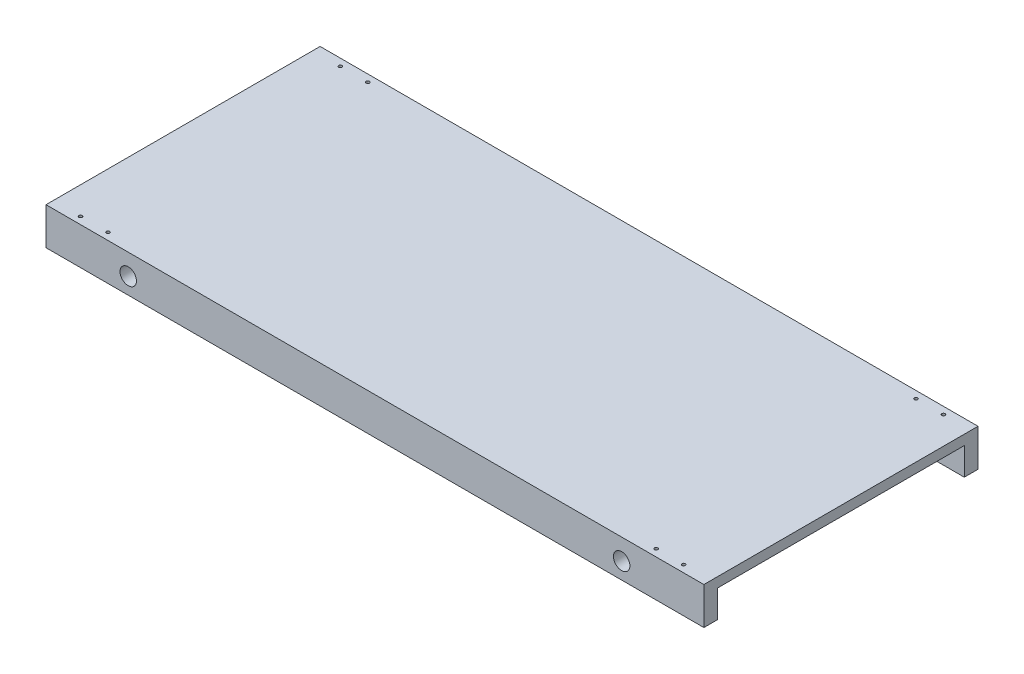
ISO-10303-21;
HEADER;
FILE_DESCRIPTION(('STEP AP214'),'2;1');
FILE_NAME('part.step','',(''),(''),'','','');
FILE_SCHEMA(('AUTOMOTIVE_DESIGN { 1 0 10303 214 1 1 1 1 }'));
ENDSEC;
DATA;
#1=APPLICATION_CONTEXT('core data for automotive mechanical design processes');
#2=APPLICATION_PROTOCOL_DEFINITION('international standard','automotive_design',2000,#1);
#3=PRODUCT_CONTEXT('',#1,'mechanical');
#4=PRODUCT('Part','Part','',(#3));
#5=PRODUCT_RELATED_PRODUCT_CATEGORY('part','',(#4));
#6=PRODUCT_DEFINITION_FORMATION('','',#4);
#7=PRODUCT_DEFINITION_CONTEXT('part definition',#1,'design');
#8=PRODUCT_DEFINITION('design','',#6,#7);
#9=PRODUCT_DEFINITION_SHAPE('','',#8);
#10=(LENGTH_UNIT() NAMED_UNIT(*) SI_UNIT(.MILLI.,.METRE.));
#11=(NAMED_UNIT(*) PLANE_ANGLE_UNIT() SI_UNIT($,.RADIAN.));
#12=(NAMED_UNIT(*) SI_UNIT($,.STERADIAN.) SOLID_ANGLE_UNIT());
#13=UNCERTAINTY_MEASURE_WITH_UNIT(LENGTH_MEASURE(1.E-05),#10,'distance_accuracy_value','');
#14=(GEOMETRIC_REPRESENTATION_CONTEXT(3) GLOBAL_UNCERTAINTY_ASSIGNED_CONTEXT((#13)) GLOBAL_UNIT_ASSIGNED_CONTEXT((#10,
#11,#12)) REPRESENTATION_CONTEXT('',''));
#15=CARTESIAN_POINT('',(0.,0.,0.));
#16=DIRECTION('',(0.,0.,1.));
#17=DIRECTION('',(1.,0.,0.));
#18=AXIS2_PLACEMENT_3D('',#15,#16,#17);
#19=CARTESIAN_POINT('',(0.,0.,0.));
#20=DIRECTION('',(0.,-1.,0.));
#21=DIRECTION('',(0.,0.,-1.));
#22=AXIS2_PLACEMENT_3D('',#19,#20,#21);
#23=PLANE('',#22);
#24=CARTESIAN_POINT('',(1100.,0.,-13.));
#25=DIRECTION('',(0.,1.,0.));
#26=DIRECTION('',(0.,0.,1.));
#27=AXIS2_PLACEMENT_3D('',#24,#25,#26);
#28=CIRCLE('',#27,2.99999999999989);
#29=CARTESIAN_POINT('',(1100.,0.,-10.0000000000001));
#30=VERTEX_POINT('',#29);
#31=EDGE_CURVE('E260',#30,#30,#28,.T.);
#32=ORIENTED_EDGE('',*,*,#31,.T.);
#33=EDGE_LOOP('',(#32));
#34=FACE_BOUND('',#33,.T.);
#35=CARTESIAN_POINT('',(1150.,0.,-13.));
#36=DIRECTION('',(0.,1.,0.));
#37=DIRECTION('',(0.,0.,1.));
#38=AXIS2_PLACEMENT_3D('',#35,#36,#37);
#39=CIRCLE('',#38,2.99999999999989);
#40=CARTESIAN_POINT('',(1150.,0.,-10.0000000000001));
#41=VERTEX_POINT('',#40);
#42=EDGE_CURVE('E252',#41,#41,#39,.T.);
#43=ORIENTED_EDGE('',*,*,#42,.T.);
#44=EDGE_LOOP('',(#43));
#45=FACE_BOUND('',#44,.T.);
#46=CARTESIAN_POINT('',(50.,0.,-13.));
#47=DIRECTION('',(0.,1.,0.));
#48=DIRECTION('',(0.,0.,1.));
#49=AXIS2_PLACEMENT_3D('',#46,#47,#48);
#50=CIRCLE('',#49,2.99999999999999);
#51=CARTESIAN_POINT('',(50.,0.,-10.));
#52=VERTEX_POINT('',#51);
#53=EDGE_CURVE('E244',#52,#52,#50,.T.);
#54=ORIENTED_EDGE('',*,*,#53,.T.);
#55=EDGE_LOOP('',(#54));
#56=FACE_BOUND('',#55,.T.);
#57=CARTESIAN_POINT('',(100.,0.,-13.));
#58=DIRECTION('',(0.,1.,0.));
#59=DIRECTION('',(0.,0.,1.));
#60=AXIS2_PLACEMENT_3D('',#57,#58,#59);
#61=CIRCLE('',#60,2.99999999999999);
#62=CARTESIAN_POINT('',(100.,0.,-10.));
#63=VERTEX_POINT('',#62);
#64=EDGE_CURVE('E236',#63,#63,#61,.T.);
#65=ORIENTED_EDGE('',*,*,#64,.T.);
#66=EDGE_LOOP('',(#65));
#67=FACE_BOUND('',#66,.T.);
#68=DIRECTION('',(-1.,0.,0.));
#69=VECTOR('',#68,1.);
#70=CARTESIAN_POINT('',(0.,0.,-25.));
#71=LINE('',#70,#69);
#72=CARTESIAN_POINT('',(1200.,0.,-25.));
#73=VERTEX_POINT('',#72);
#74=CARTESIAN_POINT('',(0.,0.,-25.));
#75=VERTEX_POINT('',#74);
#76=EDGE_CURVE('E133',#73,#75,#71,.T.);
#77=ORIENTED_EDGE('',*,*,#76,.F.);
#78=DIRECTION('',(0.,0.,-1.));
#79=VECTOR('',#78,1.);
#80=CARTESIAN_POINT('',(1200.,0.,0.));
#81=LINE('',#80,#79);
#82=CARTESIAN_POINT('',(1200.,0.,0.));
#83=VERTEX_POINT('',#82);
#84=EDGE_CURVE('E190',#83,#73,#81,.T.);
#85=ORIENTED_EDGE('',*,*,#84,.F.);
#86=DIRECTION('',(1.,0.,0.));
#87=VECTOR('',#86,1.);
#88=CARTESIAN_POINT('',(0.,0.,0.));
#89=LINE('',#88,#87);
#90=CARTESIAN_POINT('',(0.,0.,0.));
#91=VERTEX_POINT('',#90);
#92=EDGE_CURVE('E186',#91,#83,#89,.T.);
#93=ORIENTED_EDGE('',*,*,#92,.F.);
#94=DIRECTION('',(0.,0.,1.));
#95=VECTOR('',#94,1.);
#96=CARTESIAN_POINT('',(0.,0.,0.));
#97=LINE('',#96,#95);
#98=EDGE_CURVE('E169',#75,#91,#97,.T.);
#99=ORIENTED_EDGE('',*,*,#98,.F.);
#100=EDGE_LOOP('',(#77,#85,#93,#99));
#101=FACE_BOUND('',#100,.T.);
#102=ADVANCED_FACE('F38',(#34,#45,#56,#67,#101),#23,.T.);
#103=CARTESIAN_POINT('',(150.,30.,-500.));
#104=DIRECTION('',(0.,0.,1.));
#105=DIRECTION('',(1.,0.,0.));
#106=AXIS2_PLACEMENT_3D('',#103,#104,#105);
#107=CYLINDRICAL_SURFACE('',#106,15.);
#108=CARTESIAN_POINT('',(150.,30.,-25.));
#109=DIRECTION('',(0.,0.,1.));
#110=DIRECTION('',(1.,0.,0.));
#111=AXIS2_PLACEMENT_3D('',#108,#109,#110);
#112=CIRCLE('',#111,15.);
#113=CARTESIAN_POINT('',(165.,30.,-25.));
#114=VERTEX_POINT('',#113);
#115=EDGE_CURVE('E152',#114,#114,#112,.F.);
#116=ORIENTED_EDGE('',*,*,#115,.T.);
#117=EDGE_LOOP('',(#116));
#118=FACE_BOUND('',#117,.T.);
#119=CARTESIAN_POINT('',(150.,30.,0.));
#120=DIRECTION('',(0.,0.,1.));
#121=DIRECTION('',(1.,0.,0.));
#122=AXIS2_PLACEMENT_3D('',#119,#120,#121);
#123=CIRCLE('',#122,15.);
#124=CARTESIAN_POINT('',(165.,30.,0.));
#125=VERTEX_POINT('',#124);
#126=EDGE_CURVE('E161',#125,#125,#123,.T.);
#127=ORIENTED_EDGE('',*,*,#126,.T.);
#128=EDGE_LOOP('',(#127));
#129=FACE_BOUND('',#128,.T.);
#130=ADVANCED_FACE('F345',(#118,#129),#107,.F.);
#131=CARTESIAN_POINT('',(1050.,30.,0.));
#132=DIRECTION('',(0.,0.,-1.));
#133=DIRECTION('',(-1.,0.,0.));
#134=AXIS2_PLACEMENT_3D('',#131,#132,#133);
#135=CYLINDRICAL_SURFACE('',#134,14.9999999999999);
#136=CARTESIAN_POINT('',(1050.,30.,-25.));
#137=DIRECTION('',(0.,0.,1.));
#138=DIRECTION('',(1.,0.,0.));
#139=AXIS2_PLACEMENT_3D('',#136,#137,#138);
#140=CIRCLE('',#139,14.9999999999999);
#141=CARTESIAN_POINT('',(1065.,30.,-25.));
#142=VERTEX_POINT('',#141);
#143=EDGE_CURVE('E42',#142,#142,#140,.F.);
#144=ORIENTED_EDGE('',*,*,#143,.T.);
#145=EDGE_LOOP('',(#144));
#146=FACE_BOUND('',#145,.T.);
#147=CARTESIAN_POINT('',(1050.,30.,0.));
#148=DIRECTION('',(0.,0.,-1.));
#149=DIRECTION('',(-1.,0.,0.));
#150=AXIS2_PLACEMENT_3D('',#147,#148,#149);
#151=CIRCLE('',#150,14.9999999999999);
#152=CARTESIAN_POINT('',(1035.,30.,0.));
#153=VERTEX_POINT('',#152);
#154=EDGE_CURVE('E157',#153,#153,#151,.T.);
#155=ORIENTED_EDGE('',*,*,#154,.F.);
#156=EDGE_LOOP('',(#155));
#157=FACE_BOUND('',#156,.T.);
#158=ADVANCED_FACE('F329',(#146,#157),#135,.F.);
#159=CARTESIAN_POINT('',(0.,68.,0.));
#160=DIRECTION('',(1.,0.,0.));
#161=DIRECTION('',(0.,0.,-1.));
#162=AXIS2_PLACEMENT_3D('',#159,#160,#161);
#163=PLANE('',#162);
#164=DIRECTION('',(0.,0.,-1.));
#165=VECTOR('',#164,1.);
#166=CARTESIAN_POINT('',(0.,50.,-25.));
#167=LINE('',#166,#165);
#168=CARTESIAN_POINT('',(0.,50.,-25.));
#169=VERTEX_POINT('',#168);
#170=CARTESIAN_POINT('',(0.,50.,-475.));
#171=VERTEX_POINT('',#170);
#172=EDGE_CURVE('E123',#169,#171,#167,.T.);
#173=ORIENTED_EDGE('',*,*,#172,.F.);
#174=DIRECTION('',(0.,-1.,0.));
#175=VECTOR('',#174,1.);
#176=CARTESIAN_POINT('',(0.,50.,-25.));
#177=LINE('',#176,#175);
#178=EDGE_CURVE('E205',#169,#75,#177,.T.);
#179=ORIENTED_EDGE('',*,*,#178,.T.);
#180=ORIENTED_EDGE('',*,*,#98,.T.);
#181=DIRECTION('',(0.,-1.,0.));
#182=VECTOR('',#181,1.);
#183=CARTESIAN_POINT('',(0.,68.,0.));
#184=LINE('',#183,#182);
#185=CARTESIAN_POINT('',(0.,68.,0.));
#186=VERTEX_POINT('',#185);
#187=EDGE_CURVE('E11',#186,#91,#184,.T.);
#188=ORIENTED_EDGE('',*,*,#187,.F.);
#189=DIRECTION('',(0.,0.,1.));
#190=VECTOR('',#189,1.);
#191=CARTESIAN_POINT('',(0.,68.,0.));
#192=LINE('',#191,#190);
#193=CARTESIAN_POINT('',(0.,68.,-500.));
#194=VERTEX_POINT('',#193);
#195=EDGE_CURVE('E173',#194,#186,#192,.T.);
#196=ORIENTED_EDGE('',*,*,#195,.F.);
#197=DIRECTION('',(0.,-1.,0.));
#198=VECTOR('',#197,1.);
#199=CARTESIAN_POINT('',(0.,68.,-500.));
#200=LINE('',#199,#198);
#201=CARTESIAN_POINT('',(0.,0.,-500.));
#202=VERTEX_POINT('',#201);
#203=EDGE_CURVE('E183',#194,#202,#200,.T.);
#204=ORIENTED_EDGE('',*,*,#203,.T.);
#205=CARTESIAN_POINT('',(0.,0.,-475.));
#206=VERTEX_POINT('',#205);
#207=EDGE_CURVE('E137',#202,#206,#97,.T.);
#208=ORIENTED_EDGE('',*,*,#207,.T.);
#209=DIRECTION('',(0.,-1.,0.));
#210=VECTOR('',#209,1.);
#211=CARTESIAN_POINT('',(0.,50.,-475.));
#212=LINE('',#211,#210);
#213=EDGE_CURVE('E56',#171,#206,#212,.T.);
#214=ORIENTED_EDGE('',*,*,#213,.F.);
#215=EDGE_LOOP('',(#173,#179,#180,#188,#196,#204,#208,#214));
#216=FACE_BOUND('',#215,.T.);
#217=ADVANCED_FACE('F40',(#216),#163,.F.);
#218=CARTESIAN_POINT('',(0.,68.,0.));
#219=DIRECTION('',(0.,0.,-1.));
#220=DIRECTION('',(-1.,0.,0.));
#221=AXIS2_PLACEMENT_3D('',#218,#219,#220);
#222=PLANE('',#221);
#223=ORIENTED_EDGE('',*,*,#154,.T.);
#224=EDGE_LOOP('',(#223));
#225=FACE_BOUND('',#224,.T.);
#226=ORIENTED_EDGE('',*,*,#126,.F.);
#227=EDGE_LOOP('',(#226));
#228=FACE_BOUND('',#227,.T.);
#229=ORIENTED_EDGE('',*,*,#92,.T.);
#230=DIRECTION('',(0.,-1.,0.));
#231=VECTOR('',#230,1.);
#232=CARTESIAN_POINT('',(1200.,68.,0.));
#233=LINE('',#232,#231);
#234=CARTESIAN_POINT('',(1200.,68.,0.));
#235=VERTEX_POINT('',#234);
#236=EDGE_CURVE('E48',#235,#83,#233,.T.);
#237=ORIENTED_EDGE('',*,*,#236,.F.);
#238=DIRECTION('',(1.,0.,0.));
#239=VECTOR('',#238,1.);
#240=CARTESIAN_POINT('',(0.,68.,0.));
#241=LINE('',#240,#239);
#242=EDGE_CURVE('E93',#186,#235,#241,.T.);
#243=ORIENTED_EDGE('',*,*,#242,.F.);
#244=ORIENTED_EDGE('',*,*,#187,.T.);
#245=EDGE_LOOP('',(#229,#237,#243,#244));
#246=FACE_BOUND('',#245,.T.);
#247=ADVANCED_FACE('F309',(#225,#228,#246),#222,.F.);
#248=CARTESIAN_POINT('',(1200.,68.,0.));
#249=DIRECTION('',(-1.,0.,0.));
#250=DIRECTION('',(0.,0.,1.));
#251=AXIS2_PLACEMENT_3D('',#248,#249,#250);
#252=PLANE('',#251);
#253=ORIENTED_EDGE('',*,*,#84,.T.);
#254=DIRECTION('',(0.,-1.,0.));
#255=VECTOR('',#254,1.);
#256=CARTESIAN_POINT('',(1200.,50.,-25.));
#257=LINE('',#256,#255);
#258=CARTESIAN_POINT('',(1200.,50.,-25.));
#259=VERTEX_POINT('',#258);
#260=EDGE_CURVE('E142',#259,#73,#257,.T.);
#261=ORIENTED_EDGE('',*,*,#260,.F.);
#262=DIRECTION('',(0.,0.,1.));
#263=VECTOR('',#262,1.);
#264=CARTESIAN_POINT('',(1200.,50.,-25.));
#265=LINE('',#264,#263);
#266=CARTESIAN_POINT('',(1200.,50.,-475.));
#267=VERTEX_POINT('',#266);
#268=EDGE_CURVE('E122',#267,#259,#265,.T.);
#269=ORIENTED_EDGE('',*,*,#268,.F.);
#270=DIRECTION('',(0.,-1.,0.));
#271=VECTOR('',#270,1.);
#272=CARTESIAN_POINT('',(1200.,50.,-475.));
#273=LINE('',#272,#271);
#274=CARTESIAN_POINT('',(1200.,0.,-475.));
#275=VERTEX_POINT('',#274);
#276=EDGE_CURVE('E118',#267,#275,#273,.T.);
#277=ORIENTED_EDGE('',*,*,#276,.T.);
#278=CARTESIAN_POINT('',(1200.,0.,-500.));
#279=VERTEX_POINT('',#278);
#280=EDGE_CURVE('E189',#275,#279,#81,.T.);
#281=ORIENTED_EDGE('',*,*,#280,.T.);
#282=DIRECTION('',(0.,-1.,0.));
#283=VECTOR('',#282,1.);
#284=CARTESIAN_POINT('',(1200.,68.,-500.));
#285=LINE('',#284,#283);
#286=CARTESIAN_POINT('',(1200.,68.,-500.));
#287=VERTEX_POINT('',#286);
#288=EDGE_CURVE('E198',#287,#279,#285,.T.);
#289=ORIENTED_EDGE('',*,*,#288,.F.);
#290=DIRECTION('',(0.,0.,-1.));
#291=VECTOR('',#290,1.);
#292=CARTESIAN_POINT('',(1200.,68.,0.));
#293=LINE('',#292,#291);
#294=EDGE_CURVE('E178',#235,#287,#293,.T.);
#295=ORIENTED_EDGE('',*,*,#294,.F.);
#296=ORIENTED_EDGE('',*,*,#236,.T.);
#297=EDGE_LOOP('',(#253,#261,#269,#277,#281,#289,#295,#296));
#298=FACE_BOUND('',#297,.T.);
#299=ADVANCED_FACE('F314',(#298),#252,.F.);
#300=CARTESIAN_POINT('',(0.,68.,-500.));
#301=DIRECTION('',(0.,0.,1.));
#302=DIRECTION('',(1.,0.,0.));
#303=AXIS2_PLACEMENT_3D('',#300,#301,#302);
#304=PLANE('',#303);
#305=CARTESIAN_POINT('',(1050.,30.,-500.));
#306=DIRECTION('',(0.,0.,-1.));
#307=DIRECTION('',(-1.,0.,0.));
#308=AXIS2_PLACEMENT_3D('',#305,#306,#307);
#309=CIRCLE('',#308,14.9999999999999);
#310=CARTESIAN_POINT('',(1035.,30.,-500.));
#311=VERTEX_POINT('',#310);
#312=EDGE_CURVE('E156',#311,#311,#309,.T.);
#313=ORIENTED_EDGE('',*,*,#312,.F.);
#314=EDGE_LOOP('',(#313));
#315=FACE_BOUND('',#314,.T.);
#316=CARTESIAN_POINT('',(150.,30.,-500.));
#317=DIRECTION('',(0.,0.,1.));
#318=DIRECTION('',(1.,0.,0.));
#319=AXIS2_PLACEMENT_3D('',#316,#317,#318);
#320=CIRCLE('',#319,15.);
#321=CARTESIAN_POINT('',(165.,30.,-500.));
#322=VERTEX_POINT('',#321);
#323=EDGE_CURVE('E165',#322,#322,#320,.T.);
#324=ORIENTED_EDGE('',*,*,#323,.T.);
#325=EDGE_LOOP('',(#324));
#326=FACE_BOUND('',#325,.T.);
#327=DIRECTION('',(-1.,0.,0.));
#328=VECTOR('',#327,1.);
#329=CARTESIAN_POINT('',(0.,0.,-500.));
#330=LINE('',#329,#328);
#331=EDGE_CURVE('E86',#279,#202,#330,.T.);
#332=ORIENTED_EDGE('',*,*,#331,.T.);
#333=ORIENTED_EDGE('',*,*,#203,.F.);
#334=DIRECTION('',(-1.,0.,0.));
#335=VECTOR('',#334,1.);
#336=CARTESIAN_POINT('',(0.,68.,-500.));
#337=LINE('',#336,#335);
#338=EDGE_CURVE('E65',#287,#194,#337,.T.);
#339=ORIENTED_EDGE('',*,*,#338,.F.);
#340=ORIENTED_EDGE('',*,*,#288,.T.);
#341=EDGE_LOOP('',(#332,#333,#339,#340));
#342=FACE_BOUND('',#341,.T.);
#343=ADVANCED_FACE('F291',(#315,#326,#342),#304,.F.);
#344=CARTESIAN_POINT('',(0.,68.,0.));
#345=DIRECTION('',(0.,-1.,0.));
#346=DIRECTION('',(0.,0.,-1.));
#347=AXIS2_PLACEMENT_3D('',#344,#345,#346);
#348=PLANE('',#347);
#349=CARTESIAN_POINT('',(1150.,68.,-487.));
#350=DIRECTION('',(0.,1.,0.));
#351=DIRECTION('',(0.,0.,1.));
#352=AXIS2_PLACEMENT_3D('',#349,#350,#351);
#353=CIRCLE('',#352,2.99999999999989);
#354=CARTESIAN_POINT('',(1150.,68.,-484.));
#355=VERTEX_POINT('',#354);
#356=EDGE_CURVE('E280',#355,#355,#353,.T.);
#357=ORIENTED_EDGE('',*,*,#356,.F.);
#358=EDGE_LOOP('',(#357));
#359=FACE_BOUND('',#358,.T.);
#360=CARTESIAN_POINT('',(1100.,68.,-487.));
#361=DIRECTION('',(0.,1.,0.));
#362=DIRECTION('',(0.,0.,1.));
#363=AXIS2_PLACEMENT_3D('',#360,#361,#362);
#364=CIRCLE('',#363,2.99999999999989);
#365=CARTESIAN_POINT('',(1100.,68.,-484.));
#366=VERTEX_POINT('',#365);
#367=EDGE_CURVE('E272',#366,#366,#364,.T.);
#368=ORIENTED_EDGE('',*,*,#367,.F.);
#369=EDGE_LOOP('',(#368));
#370=FACE_BOUND('',#369,.T.);
#371=CARTESIAN_POINT('',(1100.,68.,-13.));
#372=DIRECTION('',(0.,1.,0.));
#373=DIRECTION('',(0.,0.,1.));
#374=AXIS2_PLACEMENT_3D('',#371,#372,#373);
#375=CIRCLE('',#374,2.99999999999989);
#376=CARTESIAN_POINT('',(1100.,68.,-10.0000000000001));
#377=VERTEX_POINT('',#376);
#378=EDGE_CURVE('E264',#377,#377,#375,.T.);
#379=ORIENTED_EDGE('',*,*,#378,.F.);
#380=EDGE_LOOP('',(#379));
#381=FACE_BOUND('',#380,.T.);
#382=CARTESIAN_POINT('',(1150.,68.,-13.));
#383=DIRECTION('',(0.,1.,0.));
#384=DIRECTION('',(0.,0.,1.));
#385=AXIS2_PLACEMENT_3D('',#382,#383,#384);
#386=CIRCLE('',#385,2.99999999999989);
#387=CARTESIAN_POINT('',(1150.,68.,-10.0000000000001));
#388=VERTEX_POINT('',#387);
#389=EDGE_CURVE('E256',#388,#388,#386,.T.);
#390=ORIENTED_EDGE('',*,*,#389,.F.);
#391=EDGE_LOOP('',(#390));
#392=FACE_BOUND('',#391,.T.);
#393=CARTESIAN_POINT('',(50.,68.,-13.));
#394=DIRECTION('',(0.,1.,0.));
#395=DIRECTION('',(0.,0.,1.));
#396=AXIS2_PLACEMENT_3D('',#393,#394,#395);
#397=CIRCLE('',#396,2.99999999999999);
#398=CARTESIAN_POINT('',(50.,68.,-10.));
#399=VERTEX_POINT('',#398);
#400=EDGE_CURVE('E248',#399,#399,#397,.T.);
#401=ORIENTED_EDGE('',*,*,#400,.F.);
#402=EDGE_LOOP('',(#401));
#403=FACE_BOUND('',#402,.T.);
#404=CARTESIAN_POINT('',(100.,68.,-13.));
#405=DIRECTION('',(0.,1.,0.));
#406=DIRECTION('',(0.,0.,1.));
#407=AXIS2_PLACEMENT_3D('',#404,#405,#406);
#408=CIRCLE('',#407,2.99999999999999);
#409=CARTESIAN_POINT('',(100.,68.,-10.));
#410=VERTEX_POINT('',#409);
#411=EDGE_CURVE('E240',#410,#410,#408,.T.);
#412=ORIENTED_EDGE('',*,*,#411,.F.);
#413=EDGE_LOOP('',(#412));
#414=FACE_BOUND('',#413,.T.);
#415=CARTESIAN_POINT('',(100.,68.,-487.));
#416=DIRECTION('',(0.,1.,0.));
#417=DIRECTION('',(0.,0.,1.));
#418=AXIS2_PLACEMENT_3D('',#415,#416,#417);
#419=CIRCLE('',#418,2.99999999999999);
#420=CARTESIAN_POINT('',(100.,68.,-484.));
#421=VERTEX_POINT('',#420);
#422=EDGE_CURVE('E232',#421,#421,#419,.T.);
#423=ORIENTED_EDGE('',*,*,#422,.F.);
#424=EDGE_LOOP('',(#423));
#425=FACE_BOUND('',#424,.T.);
#426=CARTESIAN_POINT('',(50.,68.,-487.));
#427=DIRECTION('',(0.,1.,0.));
#428=DIRECTION('',(0.,0.,1.));
#429=AXIS2_PLACEMENT_3D('',#426,#427,#428);
#430=CIRCLE('',#429,3.);
#431=CARTESIAN_POINT('',(50.,68.,-484.));
#432=VERTEX_POINT('',#431);
#433=EDGE_CURVE('E224',#432,#432,#430,.T.);
#434=ORIENTED_EDGE('',*,*,#433,.F.);
#435=EDGE_LOOP('',(#434));
#436=FACE_BOUND('',#435,.T.);
#437=ORIENTED_EDGE('',*,*,#195,.T.);
#438=ORIENTED_EDGE('',*,*,#242,.T.);
#439=ORIENTED_EDGE('',*,*,#294,.T.);
#440=ORIENTED_EDGE('',*,*,#338,.T.);
#441=EDGE_LOOP('',(#437,#438,#439,#440));
#442=FACE_BOUND('',#441,.T.);
#443=ADVANCED_FACE('F287',(#359,#370,#381,#392,#403,#414,#425,#436,#442),#348,.F.);
#444=CARTESIAN_POINT('',(1150.,0.,-487.));
#445=DIRECTION('',(0.,1.,0.));
#446=DIRECTION('',(0.,0.,1.));
#447=AXIS2_PLACEMENT_3D('',#444,#445,#446);
#448=CIRCLE('',#447,2.99999999999989);
#449=CARTESIAN_POINT('',(1150.,0.,-484.));
#450=VERTEX_POINT('',#449);
#451=EDGE_CURVE('E276',#450,#450,#448,.T.);
#452=ORIENTED_EDGE('',*,*,#451,.T.);
#453=EDGE_LOOP('',(#452));
#454=FACE_BOUND('',#453,.T.);
#455=CARTESIAN_POINT('',(1100.,0.,-487.));
#456=DIRECTION('',(0.,1.,0.));
#457=DIRECTION('',(0.,0.,1.));
#458=AXIS2_PLACEMENT_3D('',#455,#456,#457);
#459=CIRCLE('',#458,2.99999999999989);
#460=CARTESIAN_POINT('',(1100.,0.,-484.));
#461=VERTEX_POINT('',#460);
#462=EDGE_CURVE('E268',#461,#461,#459,.T.);
#463=ORIENTED_EDGE('',*,*,#462,.T.);
#464=EDGE_LOOP('',(#463));
#465=FACE_BOUND('',#464,.T.);
#466=CARTESIAN_POINT('',(100.,0.,-487.));
#467=DIRECTION('',(0.,1.,0.));
#468=DIRECTION('',(0.,0.,1.));
#469=AXIS2_PLACEMENT_3D('',#466,#467,#468);
#470=CIRCLE('',#469,2.99999999999999);
#471=CARTESIAN_POINT('',(100.,0.,-484.));
#472=VERTEX_POINT('',#471);
#473=EDGE_CURVE('E228',#472,#472,#470,.T.);
#474=ORIENTED_EDGE('',*,*,#473,.T.);
#475=EDGE_LOOP('',(#474));
#476=FACE_BOUND('',#475,.T.);
#477=CARTESIAN_POINT('',(50.,0.,-487.));
#478=DIRECTION('',(0.,1.,0.));
#479=DIRECTION('',(0.,0.,1.));
#480=AXIS2_PLACEMENT_3D('',#477,#478,#479);
#481=CIRCLE('',#480,2.99999999999999);
#482=CARTESIAN_POINT('',(50.,0.,-484.));
#483=VERTEX_POINT('',#482);
#484=EDGE_CURVE('E217',#483,#483,#481,.T.);
#485=ORIENTED_EDGE('',*,*,#484,.T.);
#486=EDGE_LOOP('',(#485));
#487=FACE_BOUND('',#486,.T.);
#488=DIRECTION('',(1.,0.,0.));
#489=VECTOR('',#488,1.);
#490=CARTESIAN_POINT('',(0.,0.,-475.));
#491=LINE('',#490,#489);
#492=EDGE_CURVE('E215',#206,#275,#491,.T.);
#493=ORIENTED_EDGE('',*,*,#492,.F.);
#494=ORIENTED_EDGE('',*,*,#207,.F.);
#495=ORIENTED_EDGE('',*,*,#331,.F.);
#496=ORIENTED_EDGE('',*,*,#280,.F.);
#497=EDGE_LOOP('',(#493,#494,#495,#496));
#498=FACE_BOUND('',#497,.T.);
#499=ADVANCED_FACE('F290',(#454,#465,#476,#487,#498),#23,.T.);
#500=CARTESIAN_POINT('',(150.,30.,-475.));
#501=DIRECTION('',(0.,0.,-1.));
#502=DIRECTION('',(-1.,0.,0.));
#503=AXIS2_PLACEMENT_3D('',#500,#501,#502);
#504=CIRCLE('',#503,15.);
#505=CARTESIAN_POINT('',(135.,30.,-475.));
#506=VERTEX_POINT('',#505);
#507=EDGE_CURVE('E147',#506,#506,#504,.F.);
#508=ORIENTED_EDGE('',*,*,#507,.T.);
#509=EDGE_LOOP('',(#508));
#510=FACE_BOUND('',#509,.T.);
#511=ORIENTED_EDGE('',*,*,#323,.F.);
#512=EDGE_LOOP('',(#511));
#513=FACE_BOUND('',#512,.T.);
#514=ADVANCED_FACE('F341',(#510,#513),#107,.F.);
#515=CARTESIAN_POINT('',(1050.,30.,-475.));
#516=DIRECTION('',(0.,0.,-1.));
#517=DIRECTION('',(-1.,0.,0.));
#518=AXIS2_PLACEMENT_3D('',#515,#516,#517);
#519=CIRCLE('',#518,14.9999999999999);
#520=CARTESIAN_POINT('',(1035.,30.,-475.));
#521=VERTEX_POINT('',#520);
#522=EDGE_CURVE('E151',#521,#521,#519,.F.);
#523=ORIENTED_EDGE('',*,*,#522,.T.);
#524=EDGE_LOOP('',(#523));
#525=FACE_BOUND('',#524,.T.);
#526=ORIENTED_EDGE('',*,*,#312,.T.);
#527=EDGE_LOOP('',(#526));
#528=FACE_BOUND('',#527,.T.);
#529=ADVANCED_FACE('F333',(#525,#528),#135,.F.);
#530=CARTESIAN_POINT('',(0.,50.,-25.));
#531=DIRECTION('',(0.,0.,1.));
#532=DIRECTION('',(1.,0.,0.));
#533=AXIS2_PLACEMENT_3D('',#530,#531,#532);
#534=PLANE('',#533);
#535=ORIENTED_EDGE('',*,*,#143,.F.);
#536=EDGE_LOOP('',(#535));
#537=FACE_BOUND('',#536,.T.);
#538=ORIENTED_EDGE('',*,*,#76,.T.);
#539=ORIENTED_EDGE('',*,*,#178,.F.);
#540=DIRECTION('',(-1.,0.,0.));
#541=VECTOR('',#540,1.);
#542=CARTESIAN_POINT('',(0.,50.,-25.));
#543=LINE('',#542,#541);
#544=EDGE_CURVE('E129',#259,#169,#543,.T.);
#545=ORIENTED_EDGE('',*,*,#544,.F.);
#546=ORIENTED_EDGE('',*,*,#260,.T.);
#547=EDGE_LOOP('',(#538,#539,#545,#546));
#548=FACE_BOUND('',#547,.T.);
#549=ORIENTED_EDGE('',*,*,#115,.F.);
#550=EDGE_LOOP('',(#549));
#551=FACE_BOUND('',#550,.T.);
#552=ADVANCED_FACE('F319',(#537,#548,#551),#534,.F.);
#553=CARTESIAN_POINT('',(0.,50.,-475.));
#554=DIRECTION('',(0.,0.,-1.));
#555=DIRECTION('',(-1.,0.,0.));
#556=AXIS2_PLACEMENT_3D('',#553,#554,#555);
#557=PLANE('',#556);
#558=ORIENTED_EDGE('',*,*,#522,.F.);
#559=EDGE_LOOP('',(#558));
#560=FACE_BOUND('',#559,.T.);
#561=ORIENTED_EDGE('',*,*,#492,.T.);
#562=ORIENTED_EDGE('',*,*,#276,.F.);
#563=DIRECTION('',(1.,0.,0.));
#564=VECTOR('',#563,1.);
#565=CARTESIAN_POINT('',(0.,50.,-475.));
#566=LINE('',#565,#564);
#567=EDGE_CURVE('E113',#171,#267,#566,.T.);
#568=ORIENTED_EDGE('',*,*,#567,.F.);
#569=ORIENTED_EDGE('',*,*,#213,.T.);
#570=EDGE_LOOP('',(#561,#562,#568,#569));
#571=FACE_BOUND('',#570,.T.);
#572=ORIENTED_EDGE('',*,*,#507,.F.);
#573=EDGE_LOOP('',(#572));
#574=FACE_BOUND('',#573,.T.);
#575=ADVANCED_FACE('F115',(#560,#571,#574),#557,.F.);
#576=CARTESIAN_POINT('',(0.,50.,0.));
#577=DIRECTION('',(0.,-1.,0.));
#578=DIRECTION('',(0.,0.,-1.));
#579=AXIS2_PLACEMENT_3D('',#576,#577,#578);
#580=PLANE('',#579);
#581=ORIENTED_EDGE('',*,*,#172,.T.);
#582=ORIENTED_EDGE('',*,*,#567,.T.);
#583=ORIENTED_EDGE('',*,*,#268,.T.);
#584=ORIENTED_EDGE('',*,*,#544,.T.);
#585=EDGE_LOOP('',(#581,#582,#583,#584));
#586=FACE_BOUND('',#585,.T.);
#587=ADVANCED_FACE('F127',(#586),#580,.T.);
#588=CARTESIAN_POINT('',(50.,68.,-487.));
#589=DIRECTION('',(0.,1.,0.));
#590=DIRECTION('',(0.,0.,1.));
#591=AXIS2_PLACEMENT_3D('',#588,#589,#590);
#592=CYLINDRICAL_SURFACE('',#591,3.);
#593=ORIENTED_EDGE('',*,*,#484,.F.);
#594=EDGE_LOOP('',(#593));
#595=FACE_BOUND('',#594,.T.);
#596=ORIENTED_EDGE('',*,*,#433,.T.);
#597=EDGE_LOOP('',(#596));
#598=FACE_BOUND('',#597,.T.);
#599=ADVANCED_FACE('F369',(#595,#598),#592,.F.);
#600=CARTESIAN_POINT('',(100.,68.,-487.));
#601=DIRECTION('',(0.,1.,0.));
#602=DIRECTION('',(0.,0.,1.));
#603=AXIS2_PLACEMENT_3D('',#600,#601,#602);
#604=CYLINDRICAL_SURFACE('',#603,2.99999999999999);
#605=ORIENTED_EDGE('',*,*,#473,.F.);
#606=EDGE_LOOP('',(#605));
#607=FACE_BOUND('',#606,.T.);
#608=ORIENTED_EDGE('',*,*,#422,.T.);
#609=EDGE_LOOP('',(#608));
#610=FACE_BOUND('',#609,.T.);
#611=ADVANCED_FACE('F372',(#607,#610),#604,.F.);
#612=CARTESIAN_POINT('',(100.,68.,-13.));
#613=DIRECTION('',(0.,1.,0.));
#614=DIRECTION('',(0.,0.,1.));
#615=AXIS2_PLACEMENT_3D('',#612,#613,#614);
#616=CYLINDRICAL_SURFACE('',#615,2.99999999999999);
#617=ORIENTED_EDGE('',*,*,#64,.F.);
#618=EDGE_LOOP('',(#617));
#619=FACE_BOUND('',#618,.T.);
#620=ORIENTED_EDGE('',*,*,#411,.T.);
#621=EDGE_LOOP('',(#620));
#622=FACE_BOUND('',#621,.T.);
#623=ADVANCED_FACE('F378',(#619,#622),#616,.F.);
#624=CARTESIAN_POINT('',(50.,68.,-13.));
#625=DIRECTION('',(0.,1.,0.));
#626=DIRECTION('',(0.,0.,1.));
#627=AXIS2_PLACEMENT_3D('',#624,#625,#626);
#628=CYLINDRICAL_SURFACE('',#627,2.99999999999999);
#629=ORIENTED_EDGE('',*,*,#53,.F.);
#630=EDGE_LOOP('',(#629));
#631=FACE_BOUND('',#630,.T.);
#632=ORIENTED_EDGE('',*,*,#400,.T.);
#633=EDGE_LOOP('',(#632));
#634=FACE_BOUND('',#633,.T.);
#635=ADVANCED_FACE('F384',(#631,#634),#628,.F.);
#636=CARTESIAN_POINT('',(1150.,68.,-13.));
#637=DIRECTION('',(0.,1.,0.));
#638=DIRECTION('',(0.,0.,1.));
#639=AXIS2_PLACEMENT_3D('',#636,#637,#638);
#640=CYLINDRICAL_SURFACE('',#639,2.99999999999989);
#641=ORIENTED_EDGE('',*,*,#42,.F.);
#642=EDGE_LOOP('',(#641));
#643=FACE_BOUND('',#642,.T.);
#644=ORIENTED_EDGE('',*,*,#389,.T.);
#645=EDGE_LOOP('',(#644));
#646=FACE_BOUND('',#645,.T.);
#647=ADVANCED_FACE('F388',(#643,#646),#640,.F.);
#648=CARTESIAN_POINT('',(1100.,68.,-13.));
#649=DIRECTION('',(0.,1.,0.));
#650=DIRECTION('',(0.,0.,1.));
#651=AXIS2_PLACEMENT_3D('',#648,#649,#650);
#652=CYLINDRICAL_SURFACE('',#651,2.99999999999989);
#653=ORIENTED_EDGE('',*,*,#31,.F.);
#654=EDGE_LOOP('',(#653));
#655=FACE_BOUND('',#654,.T.);
#656=ORIENTED_EDGE('',*,*,#378,.T.);
#657=EDGE_LOOP('',(#656));
#658=FACE_BOUND('',#657,.T.);
#659=ADVANCED_FACE('F392',(#655,#658),#652,.F.);
#660=CARTESIAN_POINT('',(1100.,68.,-487.));
#661=DIRECTION('',(0.,1.,0.));
#662=DIRECTION('',(0.,0.,1.));
#663=AXIS2_PLACEMENT_3D('',#660,#661,#662);
#664=CYLINDRICAL_SURFACE('',#663,2.99999999999989);
#665=ORIENTED_EDGE('',*,*,#462,.F.);
#666=EDGE_LOOP('',(#665));
#667=FACE_BOUND('',#666,.T.);
#668=ORIENTED_EDGE('',*,*,#367,.T.);
#669=EDGE_LOOP('',(#668));
#670=FACE_BOUND('',#669,.T.);
#671=ADVANCED_FACE('F396',(#667,#670),#664,.F.);
#672=CARTESIAN_POINT('',(1150.,68.,-487.));
#673=DIRECTION('',(0.,1.,0.));
#674=DIRECTION('',(0.,0.,1.));
#675=AXIS2_PLACEMENT_3D('',#672,#673,#674);
#676=CYLINDRICAL_SURFACE('',#675,2.99999999999989);
#677=ORIENTED_EDGE('',*,*,#451,.F.);
#678=EDGE_LOOP('',(#677));
#679=FACE_BOUND('',#678,.T.);
#680=ORIENTED_EDGE('',*,*,#356,.T.);
#681=EDGE_LOOP('',(#680));
#682=FACE_BOUND('',#681,.T.);
#683=ADVANCED_FACE('F285',(#679,#682),#676,.F.);
#684=CLOSED_SHELL('',(#102,#130,#158,#217,#247,#299,#343,#443,#499,#514,#529,#552,#575,#587,
#599,#611,#623,#635,#647,#659,#671,#683));
#685=MANIFOLD_SOLID_BREP('B2',#684);
#686=ADVANCED_BREP_SHAPE_REPRESENTATION('',(#18,#685),#14);
#687=SHAPE_DEFINITION_REPRESENTATION(#9,#686);
ENDSEC;
END-ISO-10303-21;
